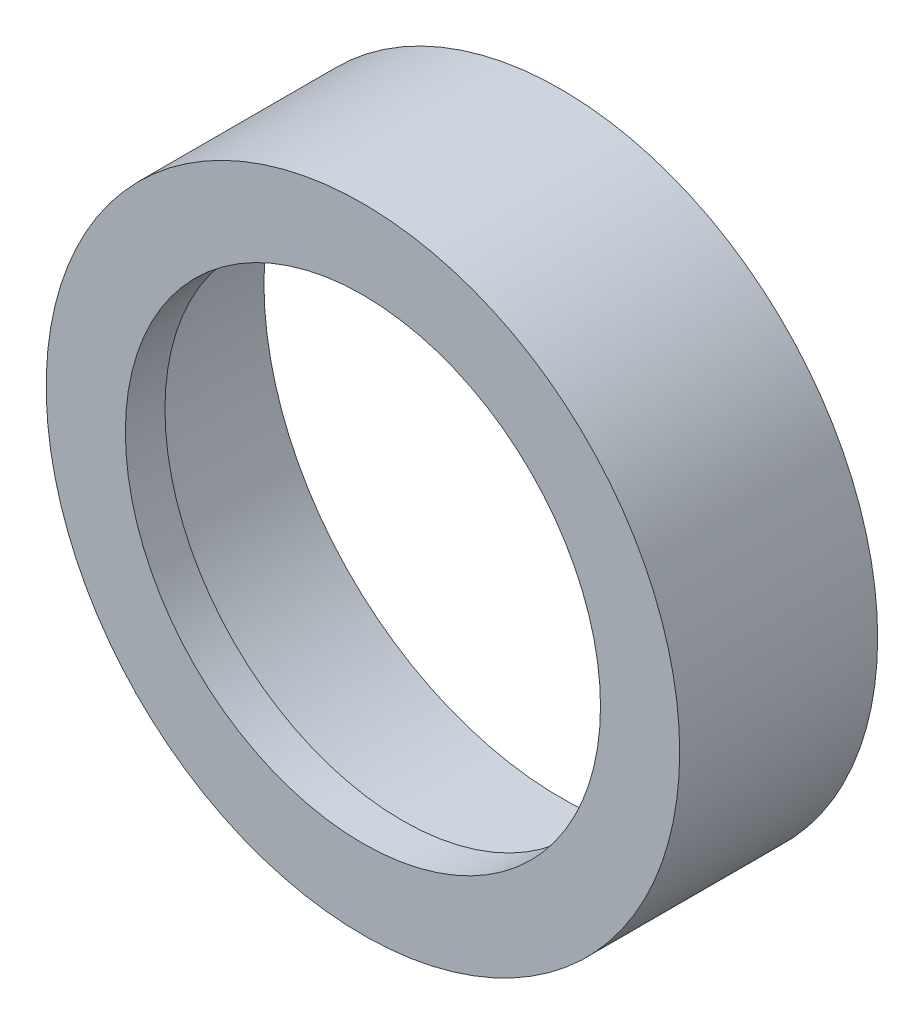
ISO-10303-21;
HEADER;
FILE_DESCRIPTION(('STEP AP214'),'2;1');
FILE_NAME('part.step','',(''),(''),'','','');
FILE_SCHEMA(('AUTOMOTIVE_DESIGN { 1 0 10303 214 1 1 1 1 }'));
ENDSEC;
DATA;
#1=APPLICATION_CONTEXT('core data for automotive mechanical design processes');
#2=APPLICATION_PROTOCOL_DEFINITION('international standard','automotive_design',2000,#1);
#3=PRODUCT_CONTEXT('',#1,'mechanical');
#4=PRODUCT('Part','Part','',(#3));
#5=PRODUCT_RELATED_PRODUCT_CATEGORY('part','',(#4));
#6=PRODUCT_DEFINITION_FORMATION('','',#4);
#7=PRODUCT_DEFINITION_CONTEXT('part definition',#1,'design');
#8=PRODUCT_DEFINITION('design','',#6,#7);
#9=PRODUCT_DEFINITION_SHAPE('','',#8);
#10=(LENGTH_UNIT() NAMED_UNIT(*) SI_UNIT(.MILLI.,.METRE.));
#11=(NAMED_UNIT(*) PLANE_ANGLE_UNIT() SI_UNIT($,.RADIAN.));
#12=(NAMED_UNIT(*) SI_UNIT($,.STERADIAN.) SOLID_ANGLE_UNIT());
#13=UNCERTAINTY_MEASURE_WITH_UNIT(LENGTH_MEASURE(1.E-05),#10,'distance_accuracy_value','');
#14=(GEOMETRIC_REPRESENTATION_CONTEXT(3) GLOBAL_UNCERTAINTY_ASSIGNED_CONTEXT((#13)) GLOBAL_UNIT_ASSIGNED_CONTEXT((#10,
#11,#12)) REPRESENTATION_CONTEXT('',''));
#15=CARTESIAN_POINT('',(0.,0.,0.));
#16=DIRECTION('',(0.,0.,1.));
#17=DIRECTION('',(1.,0.,0.));
#18=AXIS2_PLACEMENT_3D('',#15,#16,#17);
#19=CARTESIAN_POINT('',(0.,0.,-25.));
#20=DIRECTION('',(0.,0.,1.));
#21=DIRECTION('',(1.,0.,0.));
#22=AXIS2_PLACEMENT_3D('',#19,#20,#21);
#23=CYLINDRICAL_SURFACE('',#22,40.);
#24=CARTESIAN_POINT('',(0.,0.,-25.));
#25=DIRECTION('',(0.,0.,1.));
#26=DIRECTION('',(1.,0.,0.));
#27=AXIS2_PLACEMENT_3D('',#24,#25,#26);
#28=CIRCLE('',#27,40.);
#29=CARTESIAN_POINT('',(40.,0.,-25.));
#30=VERTEX_POINT('',#29);
#31=EDGE_CURVE('E10',#30,#30,#28,.T.);
#32=ORIENTED_EDGE('',*,*,#31,.T.);
#33=EDGE_LOOP('',(#32));
#34=FACE_BOUND('',#33,.T.);
#35=CARTESIAN_POINT('',(0.,0.,0.));
#36=DIRECTION('',(0.,0.,1.));
#37=DIRECTION('',(1.,0.,0.));
#38=AXIS2_PLACEMENT_3D('',#35,#36,#37);
#39=CIRCLE('',#38,40.);
#40=CARTESIAN_POINT('',(40.,0.,0.));
#41=VERTEX_POINT('',#40);
#42=EDGE_CURVE('E40',#41,#41,#39,.T.);
#43=ORIENTED_EDGE('',*,*,#42,.F.);
#44=EDGE_LOOP('',(#43));
#45=FACE_BOUND('',#44,.T.);
#46=ADVANCED_FACE('F37',(#34,#45),#23,.T.);
#47=CARTESIAN_POINT('',(0.,0.,-25.));
#48=DIRECTION('',(0.,0.,1.));
#49=DIRECTION('',(1.,0.,0.));
#50=AXIS2_PLACEMENT_3D('',#47,#48,#49);
#51=PLANE('',#50);
#52=CARTESIAN_POINT('',(0.,0.,-25.));
#53=DIRECTION('',(0.,0.,1.));
#54=DIRECTION('',(1.,0.,0.));
#55=AXIS2_PLACEMENT_3D('',#52,#53,#54);
#56=CIRCLE('',#55,37.5);
#57=CARTESIAN_POINT('',(37.5,0.,-25.));
#58=VERTEX_POINT('',#57);
#59=EDGE_CURVE('E49',#58,#58,#56,.T.);
#60=ORIENTED_EDGE('',*,*,#59,.T.);
#61=EDGE_LOOP('',(#60));
#62=FACE_BOUND('',#61,.T.);
#63=ORIENTED_EDGE('',*,*,#31,.F.);
#64=EDGE_LOOP('',(#63));
#65=FACE_BOUND('',#64,.T.);
#66=ADVANCED_FACE('F84',(#62,#65),#51,.F.);
#67=CARTESIAN_POINT('',(0.,0.,0.));
#68=DIRECTION('',(0.,0.,1.));
#69=DIRECTION('',(1.,0.,0.));
#70=AXIS2_PLACEMENT_3D('',#67,#68,#69);
#71=PLANE('',#70);
#72=ORIENTED_EDGE('',*,*,#42,.T.);
#73=EDGE_LOOP('',(#72));
#74=FACE_BOUND('',#73,.T.);
#75=CARTESIAN_POINT('',(0.,0.,0.));
#76=DIRECTION('',(0.,0.,-1.));
#77=DIRECTION('',(-1.,0.,0.));
#78=AXIS2_PLACEMENT_3D('',#75,#76,#77);
#79=CIRCLE('',#78,30.);
#80=CARTESIAN_POINT('',(-30.,0.,0.));
#81=VERTEX_POINT('',#80);
#82=EDGE_CURVE('E59',#81,#81,#79,.T.);
#83=ORIENTED_EDGE('',*,*,#82,.T.);
#84=EDGE_LOOP('',(#83));
#85=FACE_BOUND('',#84,.T.);
#86=ADVANCED_FACE('F80',(#74,#85),#71,.T.);
#87=CARTESIAN_POINT('',(0.,0.,-25.));
#88=DIRECTION('',(0.,0.,1.));
#89=DIRECTION('',(1.,0.,0.));
#90=AXIS2_PLACEMENT_3D('',#87,#88,#89);
#91=CYLINDRICAL_SURFACE('',#90,37.5);
#92=CARTESIAN_POINT('',(0.,0.,-5.));
#93=DIRECTION('',(0.,0.,-1.));
#94=DIRECTION('',(-1.,0.,0.));
#95=AXIS2_PLACEMENT_3D('',#92,#93,#94);
#96=CIRCLE('',#95,37.5);
#97=CARTESIAN_POINT('',(-37.5,0.,-5.));
#98=VERTEX_POINT('',#97);
#99=EDGE_CURVE('E54',#98,#98,#96,.T.);
#100=ORIENTED_EDGE('',*,*,#99,.F.);
#101=EDGE_LOOP('',(#100));
#102=FACE_BOUND('',#101,.T.);
#103=ORIENTED_EDGE('',*,*,#59,.F.);
#104=EDGE_LOOP('',(#103));
#105=FACE_BOUND('',#104,.T.);
#106=ADVANCED_FACE('F72',(#102,#105),#91,.F.);
#107=CARTESIAN_POINT('',(0.,0.,-5.));
#108=DIRECTION('',(0.,0.,-1.));
#109=DIRECTION('',(-1.,0.,0.));
#110=AXIS2_PLACEMENT_3D('',#107,#108,#109);
#111=PLANE('',#110);
#112=ORIENTED_EDGE('',*,*,#99,.T.);
#113=EDGE_LOOP('',(#112));
#114=FACE_BOUND('',#113,.T.);
#115=CARTESIAN_POINT('',(0.,0.,-5.));
#116=DIRECTION('',(0.,0.,-1.));
#117=DIRECTION('',(-1.,0.,0.));
#118=AXIS2_PLACEMENT_3D('',#115,#116,#117);
#119=CIRCLE('',#118,30.);
#120=CARTESIAN_POINT('',(-30.,0.,-5.));
#121=VERTEX_POINT('',#120);
#122=EDGE_CURVE('E58',#121,#121,#119,.T.);
#123=ORIENTED_EDGE('',*,*,#122,.F.);
#124=EDGE_LOOP('',(#123));
#125=FACE_BOUND('',#124,.T.);
#126=ADVANCED_FACE('F70',(#114,#125),#111,.T.);
#127=CARTESIAN_POINT('',(0.,0.,-5.));
#128=DIRECTION('',(0.,0.,1.));
#129=DIRECTION('',(1.,0.,0.));
#130=AXIS2_PLACEMENT_3D('',#127,#128,#129);
#131=CYLINDRICAL_SURFACE('',#130,30.);
#132=ORIENTED_EDGE('',*,*,#122,.T.);
#133=EDGE_LOOP('',(#132));
#134=FACE_BOUND('',#133,.T.);
#135=ORIENTED_EDGE('',*,*,#82,.F.);
#136=EDGE_LOOP('',(#135));
#137=FACE_BOUND('',#136,.T.);
#138=ADVANCED_FACE('F67',(#134,#137),#131,.F.);
#139=CLOSED_SHELL('',(#46,#66,#86,#106,#126,#138));
#140=MANIFOLD_SOLID_BREP('B2',#139);
#141=ADVANCED_BREP_SHAPE_REPRESENTATION('',(#18,#140),#14);
#142=SHAPE_DEFINITION_REPRESENTATION(#9,#141);
ENDSEC;
END-ISO-10303-21;
